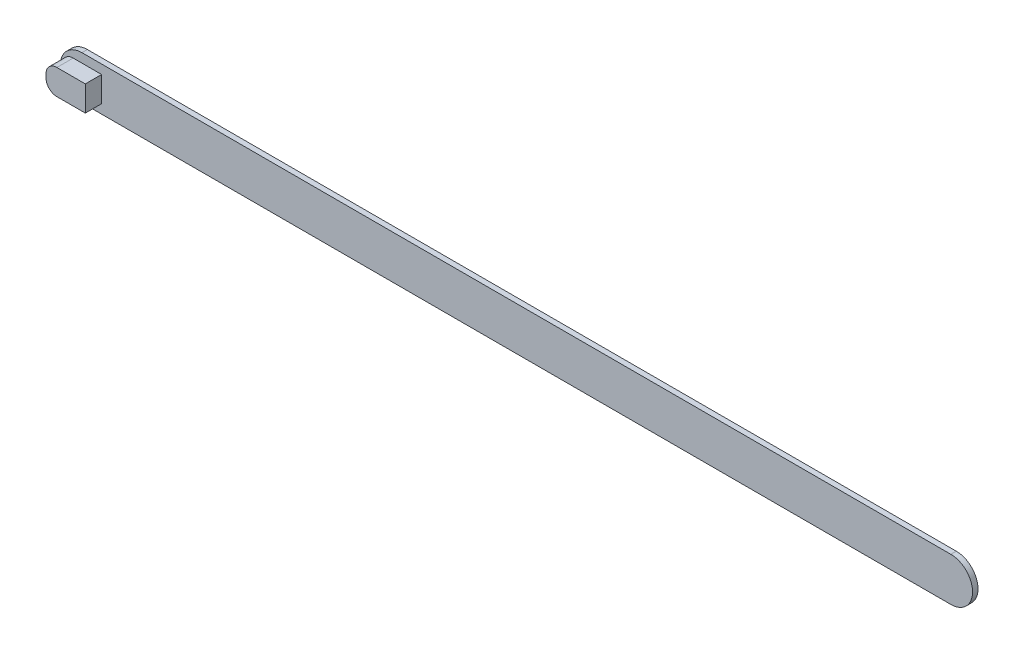
ISO-10303-21;
HEADER;
FILE_DESCRIPTION(('STEP AP214'),'2;1');
FILE_NAME('part.step','',(''),(''),'','','');
FILE_SCHEMA(('AUTOMOTIVE_DESIGN { 1 0 10303 214 1 1 1 1 }'));
ENDSEC;
DATA;
#1=APPLICATION_CONTEXT('core data for automotive mechanical design processes');
#2=APPLICATION_PROTOCOL_DEFINITION('international standard','automotive_design',2000,#1);
#3=PRODUCT_CONTEXT('',#1,'mechanical');
#4=PRODUCT('Part','Part','',(#3));
#5=PRODUCT_RELATED_PRODUCT_CATEGORY('part','',(#4));
#6=PRODUCT_DEFINITION_FORMATION('','',#4);
#7=PRODUCT_DEFINITION_CONTEXT('part definition',#1,'design');
#8=PRODUCT_DEFINITION('design','',#6,#7);
#9=PRODUCT_DEFINITION_SHAPE('','',#8);
#10=(LENGTH_UNIT() NAMED_UNIT(*) SI_UNIT(.MILLI.,.METRE.));
#11=(NAMED_UNIT(*) PLANE_ANGLE_UNIT() SI_UNIT($,.RADIAN.));
#12=(NAMED_UNIT(*) SI_UNIT($,.STERADIAN.) SOLID_ANGLE_UNIT());
#13=UNCERTAINTY_MEASURE_WITH_UNIT(LENGTH_MEASURE(1.E-05),#10,'distance_accuracy_value','');
#14=(GEOMETRIC_REPRESENTATION_CONTEXT(3) GLOBAL_UNCERTAINTY_ASSIGNED_CONTEXT((#13)) GLOBAL_UNIT_ASSIGNED_CONTEXT((#10,
#11,#12)) REPRESENTATION_CONTEXT('',''));
#15=CARTESIAN_POINT('',(0.,0.,0.));
#16=DIRECTION('',(0.,0.,1.));
#17=DIRECTION('',(1.,0.,0.));
#18=AXIS2_PLACEMENT_3D('',#15,#16,#17);
#19=CARTESIAN_POINT('',(0.,0.,0.5));
#20=DIRECTION('',(0.,0.,-1.));
#21=DIRECTION('',(-1.,0.,0.));
#22=AXIS2_PLACEMENT_3D('',#19,#20,#21);
#23=PLANE('',#22);
#24=CARTESIAN_POINT('',(0.,0.,0.5));
#25=DIRECTION('',(0.,0.,1.));
#26=DIRECTION('',(-1.,0.,0.));
#27=AXIS2_PLACEMENT_3D('',#24,#25,#26);
#28=CIRCLE('',#27,2.);
#29=CARTESIAN_POINT('',(0.,2.,0.5));
#30=VERTEX_POINT('',#29);
#31=CARTESIAN_POINT('',(0.,-2.,0.5));
#32=VERTEX_POINT('',#31);
#33=EDGE_CURVE('E158',#30,#32,#28,.T.);
#34=ORIENTED_EDGE('',*,*,#33,.T.);
#35=DIRECTION('',(1.,0.,0.));
#36=VECTOR('',#35,1.);
#37=CARTESIAN_POINT('',(0.,-2.,0.5));
#38=LINE('',#37,#36);
#39=CARTESIAN_POINT('',(80.,-2.,0.5));
#40=VERTEX_POINT('',#39);
#41=EDGE_CURVE('E162',#32,#40,#38,.T.);
#42=ORIENTED_EDGE('',*,*,#41,.T.);
#43=CARTESIAN_POINT('',(80.,0.,0.5));
#44=DIRECTION('',(0.,0.,1.));
#45=DIRECTION('',(1.,0.,0.));
#46=AXIS2_PLACEMENT_3D('',#43,#44,#45);
#47=CIRCLE('',#46,2.);
#48=CARTESIAN_POINT('',(80.,2.,0.5));
#49=VERTEX_POINT('',#48);
#50=EDGE_CURVE('E166',#40,#49,#47,.T.);
#51=ORIENTED_EDGE('',*,*,#50,.T.);
#52=DIRECTION('',(-1.,0.,0.));
#53=VECTOR('',#52,1.);
#54=CARTESIAN_POINT('',(0.,2.,0.5));
#55=LINE('',#54,#53);
#56=EDGE_CURVE('E169',#49,#30,#55,.T.);
#57=ORIENTED_EDGE('',*,*,#56,.T.);
#58=EDGE_LOOP('',(#34,#42,#51,#57));
#59=FACE_BOUND('',#58,.T.);
#60=DIRECTION('',(0.,1.,0.));
#61=VECTOR('',#60,1.);
#62=CARTESIAN_POINT('',(1.80986338298387,-1.16462551066053,0.5));
#63=LINE('',#62,#61);
#64=CARTESIAN_POINT('',(1.80986338298387,-1.16462551066053,0.5));
#65=VERTEX_POINT('',#64);
#66=CARTESIAN_POINT('',(1.80986338298387,1.16462551066053,0.5));
#67=VERTEX_POINT('',#66);
#68=EDGE_CURVE('E145',#65,#67,#63,.T.);
#69=ORIENTED_EDGE('',*,*,#68,.F.);
#70=DIRECTION('',(1.,0.,0.));
#71=VECTOR('',#70,1.);
#72=CARTESIAN_POINT('',(-0.809863382983862,-1.16462551066053,0.5));
#73=LINE('',#72,#71);
#74=CARTESIAN_POINT('',(-0.809863382983862,-1.16462551066053,0.5));
#75=VERTEX_POINT('',#74);
#76=EDGE_CURVE('E142',#75,#65,#73,.T.);
#77=ORIENTED_EDGE('',*,*,#76,.F.);
#78=CARTESIAN_POINT('',(-0.809863382983869,-0.164625510660529,0.5));
#79=DIRECTION('',(0.,0.,1.));
#80=DIRECTION('',(-1.,0.,0.));
#81=AXIS2_PLACEMENT_3D('',#78,#79,#80);
#82=CIRCLE('',#81,1.);
#83=CARTESIAN_POINT('',(-1.80986338298387,-0.164625510660529,0.5));
#84=VERTEX_POINT('',#83);
#85=EDGE_CURVE('E310',#84,#75,#82,.T.);
#86=ORIENTED_EDGE('',*,*,#85,.F.);
#87=DIRECTION('',(0.,-1.,0.));
#88=VECTOR('',#87,1.);
#89=CARTESIAN_POINT('',(-1.80986338298387,-0.164625510660522,0.5));
#90=LINE('',#89,#88);
#91=CARTESIAN_POINT('',(-1.80986338298387,0.164625510660522,0.5));
#92=VERTEX_POINT('',#91);
#93=EDGE_CURVE('E330',#92,#84,#90,.T.);
#94=ORIENTED_EDGE('',*,*,#93,.F.);
#95=CARTESIAN_POINT('',(-0.809863382983869,0.164625510660529,0.5));
#96=DIRECTION('',(0.,0.,1.));
#97=DIRECTION('',(-1.,0.,0.));
#98=AXIS2_PLACEMENT_3D('',#95,#96,#97);
#99=CIRCLE('',#98,1.);
#100=CARTESIAN_POINT('',(-0.809863382983862,1.16462551066053,0.5));
#101=VERTEX_POINT('',#100);
#102=EDGE_CURVE('E66',#101,#92,#99,.T.);
#103=ORIENTED_EDGE('',*,*,#102,.F.);
#104=DIRECTION('',(-1.,0.,0.));
#105=VECTOR('',#104,1.);
#106=CARTESIAN_POINT('',(-0.809863382983862,1.16462551066053,0.5));
#107=LINE('',#106,#105);
#108=EDGE_CURVE('E61',#67,#101,#107,.T.);
#109=ORIENTED_EDGE('',*,*,#108,.F.);
#110=EDGE_LOOP('',(#69,#77,#86,#94,#103,#109));
#111=FACE_BOUND('',#110,.T.);
#112=ADVANCED_FACE('F45',(#59,#111),#23,.F.);
#113=CARTESIAN_POINT('',(0.,0.,0.5));
#114=DIRECTION('',(0.,0.,-1.));
#115=DIRECTION('',(-1.,0.,0.));
#116=AXIS2_PLACEMENT_3D('',#113,#114,#115);
#117=CYLINDRICAL_SURFACE('',#116,2.);
#118=CARTESIAN_POINT('',(0.,0.,0.));
#119=DIRECTION('',(0.,0.,1.));
#120=DIRECTION('',(-1.,0.,0.));
#121=AXIS2_PLACEMENT_3D('',#118,#119,#120);
#122=CIRCLE('',#121,2.);
#123=CARTESIAN_POINT('',(0.,2.,0.));
#124=VERTEX_POINT('',#123);
#125=CARTESIAN_POINT('',(0.,-2.,0.));
#126=VERTEX_POINT('',#125);
#127=EDGE_CURVE('E147',#124,#126,#122,.T.);
#128=ORIENTED_EDGE('',*,*,#127,.T.);
#129=DIRECTION('',(0.,0.,-1.));
#130=VECTOR('',#129,1.);
#131=CARTESIAN_POINT('',(0.,-2.,0.5));
#132=LINE('',#131,#130);
#133=EDGE_CURVE('E11',#32,#126,#132,.T.);
#134=ORIENTED_EDGE('',*,*,#133,.F.);
#135=ORIENTED_EDGE('',*,*,#33,.F.);
#136=DIRECTION('',(0.,0.,-1.));
#137=VECTOR('',#136,1.);
#138=CARTESIAN_POINT('',(0.,2.,0.5));
#139=LINE('',#138,#137);
#140=EDGE_CURVE('E171',#30,#124,#139,.T.);
#141=ORIENTED_EDGE('',*,*,#140,.T.);
#142=EDGE_LOOP('',(#128,#134,#135,#141));
#143=FACE_BOUND('',#142,.T.);
#144=ADVANCED_FACE('F47',(#143),#117,.T.);
#145=CARTESIAN_POINT('',(0.,-2.,0.5));
#146=DIRECTION('',(0.,1.,0.));
#147=DIRECTION('',(0.,0.,1.));
#148=AXIS2_PLACEMENT_3D('',#145,#146,#147);
#149=PLANE('',#148);
#150=DIRECTION('',(1.,0.,0.));
#151=VECTOR('',#150,1.);
#152=CARTESIAN_POINT('',(0.,-2.,0.));
#153=LINE('',#152,#151);
#154=CARTESIAN_POINT('',(80.,-2.,0.));
#155=VERTEX_POINT('',#154);
#156=EDGE_CURVE('E152',#126,#155,#153,.T.);
#157=ORIENTED_EDGE('',*,*,#156,.T.);
#158=DIRECTION('',(0.,0.,-1.));
#159=VECTOR('',#158,1.);
#160=CARTESIAN_POINT('',(80.,-2.,0.5));
#161=LINE('',#160,#159);
#162=EDGE_CURVE('E54',#40,#155,#161,.T.);
#163=ORIENTED_EDGE('',*,*,#162,.F.);
#164=ORIENTED_EDGE('',*,*,#41,.F.);
#165=ORIENTED_EDGE('',*,*,#133,.T.);
#166=EDGE_LOOP('',(#157,#163,#164,#165));
#167=FACE_BOUND('',#166,.T.);
#168=ADVANCED_FACE('F207',(#167),#149,.F.);
#169=CARTESIAN_POINT('',(80.,0.,0.5));
#170=DIRECTION('',(0.,0.,-1.));
#171=DIRECTION('',(-1.,0.,0.));
#172=AXIS2_PLACEMENT_3D('',#169,#170,#171);
#173=CYLINDRICAL_SURFACE('',#172,2.);
#174=CARTESIAN_POINT('',(80.,0.,0.));
#175=DIRECTION('',(0.,0.,1.));
#176=DIRECTION('',(1.,0.,0.));
#177=AXIS2_PLACEMENT_3D('',#174,#175,#176);
#178=CIRCLE('',#177,2.);
#179=CARTESIAN_POINT('',(80.,2.,0.));
#180=VERTEX_POINT('',#179);
#181=EDGE_CURVE('E175',#155,#180,#178,.T.);
#182=ORIENTED_EDGE('',*,*,#181,.T.);
#183=DIRECTION('',(0.,0.,-1.));
#184=VECTOR('',#183,1.);
#185=CARTESIAN_POINT('',(80.,2.,0.5));
#186=LINE('',#185,#184);
#187=EDGE_CURVE('E183',#49,#180,#186,.T.);
#188=ORIENTED_EDGE('',*,*,#187,.F.);
#189=ORIENTED_EDGE('',*,*,#50,.F.);
#190=ORIENTED_EDGE('',*,*,#162,.T.);
#191=EDGE_LOOP('',(#182,#188,#189,#190));
#192=FACE_BOUND('',#191,.T.);
#193=ADVANCED_FACE('F192',(#192),#173,.T.);
#194=CARTESIAN_POINT('',(0.,2.,0.5));
#195=DIRECTION('',(0.,-1.,0.));
#196=DIRECTION('',(0.,0.,-1.));
#197=AXIS2_PLACEMENT_3D('',#194,#195,#196);
#198=PLANE('',#197);
#199=DIRECTION('',(-1.,0.,0.));
#200=VECTOR('',#199,1.);
#201=CARTESIAN_POINT('',(0.,2.,0.));
#202=LINE('',#201,#200);
#203=EDGE_CURVE('E163',#180,#124,#202,.T.);
#204=ORIENTED_EDGE('',*,*,#203,.T.);
#205=ORIENTED_EDGE('',*,*,#140,.F.);
#206=ORIENTED_EDGE('',*,*,#56,.F.);
#207=ORIENTED_EDGE('',*,*,#187,.T.);
#208=EDGE_LOOP('',(#204,#205,#206,#207));
#209=FACE_BOUND('',#208,.T.);
#210=ADVANCED_FACE('F201',(#209),#198,.F.);
#211=CARTESIAN_POINT('',(0.,0.,0.));
#212=DIRECTION('',(0.,0.,-1.));
#213=DIRECTION('',(-1.,0.,0.));
#214=AXIS2_PLACEMENT_3D('',#211,#212,#213);
#215=PLANE('',#214);
#216=ORIENTED_EDGE('',*,*,#127,.F.);
#217=ORIENTED_EDGE('',*,*,#203,.F.);
#218=ORIENTED_EDGE('',*,*,#181,.F.);
#219=ORIENTED_EDGE('',*,*,#156,.F.);
#220=EDGE_LOOP('',(#216,#217,#218,#219));
#221=FACE_BOUND('',#220,.T.);
#222=ADVANCED_FACE('F198',(#221),#215,.T.);
#223=CARTESIAN_POINT('',(1.80986338298387,-1.16462551066053,2.));
#224=DIRECTION('',(-1.,0.,0.));
#225=DIRECTION('',(0.,0.,1.));
#226=AXIS2_PLACEMENT_3D('',#223,#224,#225);
#227=PLANE('',#226);
#228=ORIENTED_EDGE('',*,*,#68,.T.);
#229=DIRECTION('',(0.,0.,-1.));
#230=VECTOR('',#229,1.);
#231=CARTESIAN_POINT('',(1.80986338298387,1.16462551066053,2.));
#232=LINE('',#231,#230);
#233=CARTESIAN_POINT('',(1.80986338298387,1.16462551066053,2.));
#234=VERTEX_POINT('',#233);
#235=EDGE_CURVE('E124',#234,#67,#232,.T.);
#236=ORIENTED_EDGE('',*,*,#235,.F.);
#237=DIRECTION('',(0.,1.,0.));
#238=VECTOR('',#237,1.);
#239=CARTESIAN_POINT('',(1.80986338298387,-1.16462551066053,2.));
#240=LINE('',#239,#238);
#241=CARTESIAN_POINT('',(1.80986338298387,-1.16462551066053,2.));
#242=VERTEX_POINT('',#241);
#243=EDGE_CURVE('E132',#242,#234,#240,.T.);
#244=ORIENTED_EDGE('',*,*,#243,.F.);
#245=DIRECTION('',(0.,0.,-1.));
#246=VECTOR('',#245,1.);
#247=CARTESIAN_POINT('',(1.80986338298387,-1.16462551066053,2.));
#248=LINE('',#247,#246);
#249=EDGE_CURVE('E305',#242,#65,#248,.T.);
#250=ORIENTED_EDGE('',*,*,#249,.T.);
#251=EDGE_LOOP('',(#228,#236,#244,#250));
#252=FACE_BOUND('',#251,.T.);
#253=ADVANCED_FACE('F144',(#252),#227,.F.);
#254=CARTESIAN_POINT('',(-0.809863382983862,1.16462551066053,2.));
#255=DIRECTION('',(0.,-1.,0.));
#256=DIRECTION('',(0.,0.,-1.));
#257=AXIS2_PLACEMENT_3D('',#254,#255,#256);
#258=PLANE('',#257);
#259=ORIENTED_EDGE('',*,*,#108,.T.);
#260=DIRECTION('',(0.,0.,-1.));
#261=VECTOR('',#260,1.);
#262=CARTESIAN_POINT('',(-0.809863382983862,1.16462551066053,2.));
#263=LINE('',#262,#261);
#264=CARTESIAN_POINT('',(-0.809863382983862,1.16462551066053,2.));
#265=VERTEX_POINT('',#264);
#266=EDGE_CURVE('E127',#265,#101,#263,.T.);
#267=ORIENTED_EDGE('',*,*,#266,.F.);
#268=DIRECTION('',(-1.,0.,0.));
#269=VECTOR('',#268,1.);
#270=CARTESIAN_POINT('',(-0.809863382983862,1.16462551066053,2.));
#271=LINE('',#270,#269);
#272=EDGE_CURVE('E120',#234,#265,#271,.T.);
#273=ORIENTED_EDGE('',*,*,#272,.F.);
#274=ORIENTED_EDGE('',*,*,#235,.T.);
#275=EDGE_LOOP('',(#259,#267,#273,#274));
#276=FACE_BOUND('',#275,.T.);
#277=ADVANCED_FACE('F122',(#276),#258,.F.);
#278=CARTESIAN_POINT('',(-0.809863382983869,0.164625510660529,2.));
#279=DIRECTION('',(0.,0.,-1.));
#280=DIRECTION('',(-1.,0.,0.));
#281=AXIS2_PLACEMENT_3D('',#278,#279,#280);
#282=CYLINDRICAL_SURFACE('',#281,1.);
#283=ORIENTED_EDGE('',*,*,#102,.T.);
#284=DIRECTION('',(0.,0.,-1.));
#285=VECTOR('',#284,1.);
#286=CARTESIAN_POINT('',(-1.80986338298387,0.164625510660522,2.));
#287=LINE('',#286,#285);
#288=CARTESIAN_POINT('',(-1.80986338298387,0.164625510660522,2.));
#289=VERTEX_POINT('',#288);
#290=EDGE_CURVE('E154',#289,#92,#287,.T.);
#291=ORIENTED_EDGE('',*,*,#290,.F.);
#292=CARTESIAN_POINT('',(-0.809863382983869,0.164625510660529,2.));
#293=DIRECTION('',(0.,0.,1.));
#294=DIRECTION('',(-1.,0.,0.));
#295=AXIS2_PLACEMENT_3D('',#292,#293,#294);
#296=CIRCLE('',#295,1.);
#297=EDGE_CURVE('E131',#265,#289,#296,.T.);
#298=ORIENTED_EDGE('',*,*,#297,.F.);
#299=ORIENTED_EDGE('',*,*,#266,.T.);
#300=EDGE_LOOP('',(#283,#291,#298,#299));
#301=FACE_BOUND('',#300,.T.);
#302=ADVANCED_FACE('F254',(#301),#282,.T.);
#303=CARTESIAN_POINT('',(-1.80986338298387,-0.164625510660522,2.));
#304=DIRECTION('',(1.,0.,0.));
#305=DIRECTION('',(0.,0.,-1.));
#306=AXIS2_PLACEMENT_3D('',#303,#304,#305);
#307=PLANE('',#306);
#308=ORIENTED_EDGE('',*,*,#93,.T.);
#309=DIRECTION('',(0.,0.,-1.));
#310=VECTOR('',#309,1.);
#311=CARTESIAN_POINT('',(-1.80986338298387,-0.164625510660522,2.));
#312=LINE('',#311,#310);
#313=CARTESIAN_POINT('',(-1.80986338298387,-0.164625510660522,2.));
#314=VERTEX_POINT('',#313);
#315=EDGE_CURVE('E316',#314,#84,#312,.T.);
#316=ORIENTED_EDGE('',*,*,#315,.F.);
#317=DIRECTION('',(0.,-1.,0.));
#318=VECTOR('',#317,1.);
#319=CARTESIAN_POINT('',(-1.80986338298387,-0.164625510660522,2.));
#320=LINE('',#319,#318);
#321=EDGE_CURVE('E331',#289,#314,#320,.T.);
#322=ORIENTED_EDGE('',*,*,#321,.F.);
#323=ORIENTED_EDGE('',*,*,#290,.T.);
#324=EDGE_LOOP('',(#308,#316,#322,#323));
#325=FACE_BOUND('',#324,.T.);
#326=ADVANCED_FACE('F262',(#325),#307,.F.);
#327=CARTESIAN_POINT('',(-0.809863382983869,-0.164625510660529,2.));
#328=DIRECTION('',(0.,0.,-1.));
#329=DIRECTION('',(-1.,0.,0.));
#330=AXIS2_PLACEMENT_3D('',#327,#328,#329);
#331=CYLINDRICAL_SURFACE('',#330,1.);
#332=ORIENTED_EDGE('',*,*,#85,.T.);
#333=DIRECTION('',(0.,0.,-1.));
#334=VECTOR('',#333,1.);
#335=CARTESIAN_POINT('',(-0.809863382983862,-1.16462551066053,2.));
#336=LINE('',#335,#334);
#337=CARTESIAN_POINT('',(-0.809863382983862,-1.16462551066053,2.));
#338=VERTEX_POINT('',#337);
#339=EDGE_CURVE('E307',#338,#75,#336,.T.);
#340=ORIENTED_EDGE('',*,*,#339,.F.);
#341=CARTESIAN_POINT('',(-0.809863382983869,-0.164625510660529,2.));
#342=DIRECTION('',(0.,0.,1.));
#343=DIRECTION('',(-1.,0.,0.));
#344=AXIS2_PLACEMENT_3D('',#341,#342,#343);
#345=CIRCLE('',#344,1.);
#346=EDGE_CURVE('E318',#314,#338,#345,.T.);
#347=ORIENTED_EDGE('',*,*,#346,.F.);
#348=ORIENTED_EDGE('',*,*,#315,.T.);
#349=EDGE_LOOP('',(#332,#340,#347,#348));
#350=FACE_BOUND('',#349,.T.);
#351=ADVANCED_FACE('F272',(#350),#331,.T.);
#352=CARTESIAN_POINT('',(-0.809863382983862,-1.16462551066053,2.));
#353=DIRECTION('',(0.,1.,0.));
#354=DIRECTION('',(0.,0.,1.));
#355=AXIS2_PLACEMENT_3D('',#352,#353,#354);
#356=PLANE('',#355);
#357=ORIENTED_EDGE('',*,*,#76,.T.);
#358=ORIENTED_EDGE('',*,*,#249,.F.);
#359=DIRECTION('',(1.,0.,0.));
#360=VECTOR('',#359,1.);
#361=CARTESIAN_POINT('',(-0.809863382983862,-1.16462551066053,2.));
#362=LINE('',#361,#360);
#363=EDGE_CURVE('E137',#338,#242,#362,.T.);
#364=ORIENTED_EDGE('',*,*,#363,.F.);
#365=ORIENTED_EDGE('',*,*,#339,.T.);
#366=EDGE_LOOP('',(#357,#358,#364,#365));
#367=FACE_BOUND('',#366,.T.);
#368=ADVANCED_FACE('F282',(#367),#356,.F.);
#369=CARTESIAN_POINT('',(-0.809863382983869,0.164625510660529,2.));
#370=DIRECTION('',(0.,0.,-1.));
#371=DIRECTION('',(-1.,0.,0.));
#372=AXIS2_PLACEMENT_3D('',#369,#370,#371);
#373=PLANE('',#372);
#374=ORIENTED_EDGE('',*,*,#243,.T.);
#375=ORIENTED_EDGE('',*,*,#272,.T.);
#376=ORIENTED_EDGE('',*,*,#297,.T.);
#377=ORIENTED_EDGE('',*,*,#321,.T.);
#378=ORIENTED_EDGE('',*,*,#346,.T.);
#379=ORIENTED_EDGE('',*,*,#363,.T.);
#380=EDGE_LOOP('',(#374,#375,#376,#377,#378,#379));
#381=FACE_BOUND('',#380,.T.);
#382=ADVANCED_FACE('F135',(#381),#373,.F.);
#383=CLOSED_SHELL('',(#112,#144,#168,#193,#210,#222,#253,#277,#302,#326,#351,#368,#382));
#384=MANIFOLD_SOLID_BREP('B2',#383);
#385=ADVANCED_BREP_SHAPE_REPRESENTATION('',(#18,#384),#14);
#386=SHAPE_DEFINITION_REPRESENTATION(#9,#385);
ENDSEC;
END-ISO-10303-21;
